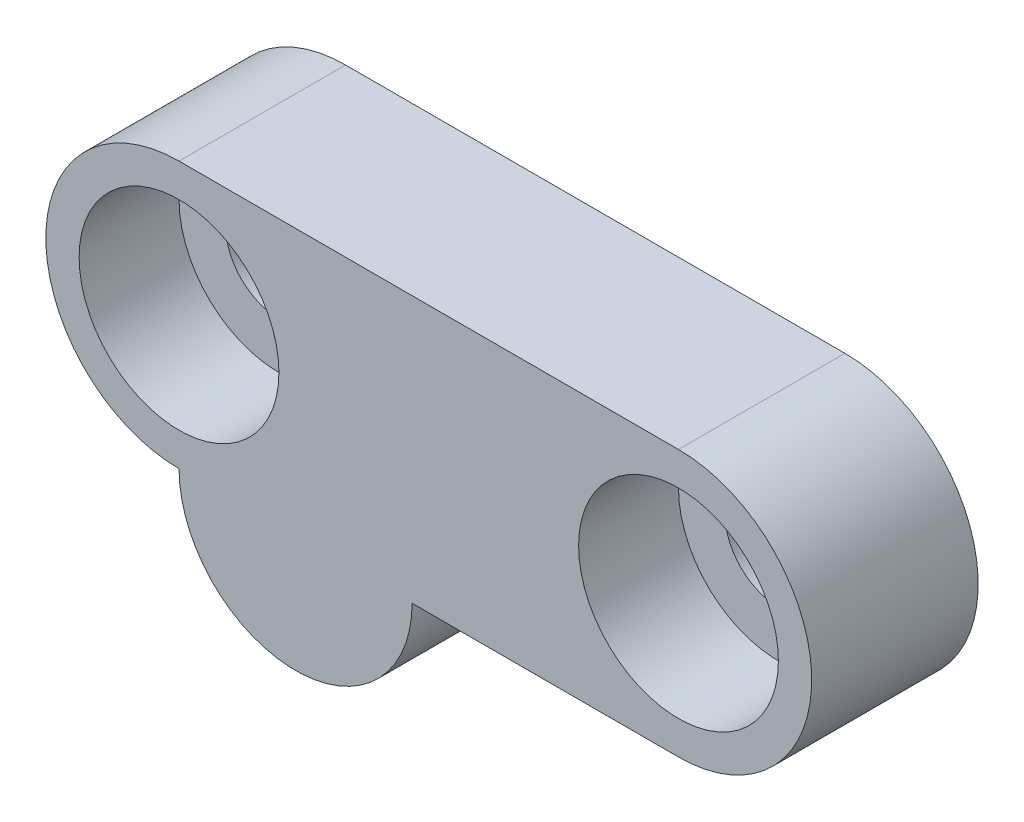
ISO-10303-21;
HEADER;
FILE_DESCRIPTION(('STEP AP214'),'2;1');
FILE_NAME('part.step','',(''),(''),'','','');
FILE_SCHEMA(('AUTOMOTIVE_DESIGN { 1 0 10303 214 1 1 1 1 }'));
ENDSEC;
DATA;
#1=APPLICATION_CONTEXT('core data for automotive mechanical design processes');
#2=APPLICATION_PROTOCOL_DEFINITION('international standard','automotive_design',2000,#1);
#3=PRODUCT_CONTEXT('',#1,'mechanical');
#4=PRODUCT('Part','Part','',(#3));
#5=PRODUCT_RELATED_PRODUCT_CATEGORY('part','',(#4));
#6=PRODUCT_DEFINITION_FORMATION('','',#4);
#7=PRODUCT_DEFINITION_CONTEXT('part definition',#1,'design');
#8=PRODUCT_DEFINITION('design','',#6,#7);
#9=PRODUCT_DEFINITION_SHAPE('','',#8);
#10=(LENGTH_UNIT() NAMED_UNIT(*) SI_UNIT(.MILLI.,.METRE.));
#11=(NAMED_UNIT(*) PLANE_ANGLE_UNIT() SI_UNIT($,.RADIAN.));
#12=(NAMED_UNIT(*) SI_UNIT($,.STERADIAN.) SOLID_ANGLE_UNIT());
#13=UNCERTAINTY_MEASURE_WITH_UNIT(LENGTH_MEASURE(1.E-05),#10,'distance_accuracy_value','');
#14=(GEOMETRIC_REPRESENTATION_CONTEXT(3) GLOBAL_UNCERTAINTY_ASSIGNED_CONTEXT((#13)) GLOBAL_UNIT_ASSIGNED_CONTEXT((#10,
#11,#12)) REPRESENTATION_CONTEXT('',''));
#15=CARTESIAN_POINT('',(0.,0.,0.));
#16=DIRECTION('',(0.,0.,1.));
#17=DIRECTION('',(1.,0.,0.));
#18=AXIS2_PLACEMENT_3D('',#15,#16,#17);
#19=CARTESIAN_POINT('',(0.,0.,27.));
#20=DIRECTION('',(0.,0.,-1.));
#21=DIRECTION('',(-1.,0.,0.));
#22=AXIS2_PLACEMENT_3D('',#19,#20,#21);
#23=CYLINDRICAL_SURFACE('',#22,1.6);
#24=CARTESIAN_POINT('',(0.,0.,22.));
#25=DIRECTION('',(0.,0.,1.));
#26=DIRECTION('',(1.,0.,0.));
#27=AXIS2_PLACEMENT_3D('',#24,#25,#26);
#28=CIRCLE('',#27,1.6);
#29=CARTESIAN_POINT('',(1.6,0.,22.));
#30=VERTEX_POINT('',#29);
#31=EDGE_CURVE('E120',#30,#30,#28,.T.);
#32=ORIENTED_EDGE('',*,*,#31,.F.);
#33=EDGE_LOOP('',(#32));
#34=FACE_BOUND('',#33,.T.);
#35=CARTESIAN_POINT('',(0.,0.,24.));
#36=DIRECTION('',(0.,0.,1.));
#37=DIRECTION('',(1.,0.,0.));
#38=AXIS2_PLACEMENT_3D('',#35,#36,#37);
#39=CIRCLE('',#38,1.6);
#40=CARTESIAN_POINT('',(1.6,0.,24.));
#41=VERTEX_POINT('',#40);
#42=EDGE_CURVE('E43',#41,#41,#39,.T.);
#43=ORIENTED_EDGE('',*,*,#42,.T.);
#44=EDGE_LOOP('',(#43));
#45=FACE_BOUND('',#44,.T.);
#46=ADVANCED_FACE('F39',(#34,#45),#23,.F.);
#47=CARTESIAN_POINT('',(15.,0.,27.));
#48=DIRECTION('',(0.,0.,-1.));
#49=DIRECTION('',(-1.,0.,0.));
#50=AXIS2_PLACEMENT_3D('',#47,#48,#49);
#51=CYLINDRICAL_SURFACE('',#50,1.6);
#52=CARTESIAN_POINT('',(15.,0.,22.));
#53=DIRECTION('',(0.,0.,1.));
#54=DIRECTION('',(1.,0.,0.));
#55=AXIS2_PLACEMENT_3D('',#52,#53,#54);
#56=CIRCLE('',#55,1.6);
#57=CARTESIAN_POINT('',(16.6,0.,22.));
#58=VERTEX_POINT('',#57);
#59=EDGE_CURVE('E134',#58,#58,#56,.T.);
#60=ORIENTED_EDGE('',*,*,#59,.F.);
#61=EDGE_LOOP('',(#60));
#62=FACE_BOUND('',#61,.T.);
#63=CARTESIAN_POINT('',(15.,0.,24.));
#64=DIRECTION('',(0.,0.,1.));
#65=DIRECTION('',(1.,0.,0.));
#66=AXIS2_PLACEMENT_3D('',#63,#64,#65);
#67=CIRCLE('',#66,1.6);
#68=CARTESIAN_POINT('',(16.6,0.,24.));
#69=VERTEX_POINT('',#68);
#70=EDGE_CURVE('E128',#69,#69,#67,.T.);
#71=ORIENTED_EDGE('',*,*,#70,.T.);
#72=EDGE_LOOP('',(#71));
#73=FACE_BOUND('',#72,.T.);
#74=ADVANCED_FACE('F167',(#62,#73),#51,.F.);
#75=CARTESIAN_POINT('',(0.,0.,27.));
#76=DIRECTION('',(0.,0.,1.));
#77=DIRECTION('',(1.,0.,0.));
#78=AXIS2_PLACEMENT_3D('',#75,#76,#77);
#79=PLANE('',#78);
#80=CARTESIAN_POINT('',(0.,0.,27.));
#81=DIRECTION('',(0.,0.,1.));
#82=DIRECTION('',(1.,0.,0.));
#83=AXIS2_PLACEMENT_3D('',#80,#81,#82);
#84=CIRCLE('',#83,3.);
#85=CARTESIAN_POINT('',(3.,0.,27.));
#86=VERTEX_POINT('',#85);
#87=EDGE_CURVE('E136',#86,#86,#84,.T.);
#88=ORIENTED_EDGE('',*,*,#87,.F.);
#89=EDGE_LOOP('',(#88));
#90=FACE_BOUND('',#89,.T.);
#91=CARTESIAN_POINT('',(15.,0.,27.));
#92=DIRECTION('',(0.,0.,1.));
#93=DIRECTION('',(1.,0.,0.));
#94=AXIS2_PLACEMENT_3D('',#91,#92,#93);
#95=CIRCLE('',#94,3.);
#96=CARTESIAN_POINT('',(18.,0.,27.));
#97=VERTEX_POINT('',#96);
#98=EDGE_CURVE('E141',#97,#97,#95,.T.);
#99=ORIENTED_EDGE('',*,*,#98,.F.);
#100=EDGE_LOOP('',(#99));
#101=FACE_BOUND('',#100,.T.);
#102=CARTESIAN_POINT('',(0.,0.,27.));
#103=DIRECTION('',(0.,0.,1.));
#104=DIRECTION('',(1.,0.,0.));
#105=AXIS2_PLACEMENT_3D('',#102,#103,#104);
#106=CIRCLE('',#105,4.);
#107=CARTESIAN_POINT('',(0.,4.,27.));
#108=VERTEX_POINT('',#107);
#109=CARTESIAN_POINT('',(0.,-4.,27.));
#110=VERTEX_POINT('',#109);
#111=EDGE_CURVE('E125',#108,#110,#106,.T.);
#112=ORIENTED_EDGE('',*,*,#111,.T.);
#113=CARTESIAN_POINT('',(3.5,-4.,27.));
#114=DIRECTION('',(0.,0.,1.));
#115=DIRECTION('',(1.,0.,0.));
#116=AXIS2_PLACEMENT_3D('',#113,#114,#115);
#117=CIRCLE('',#116,3.5);
#118=CARTESIAN_POINT('',(7.,-4.,27.));
#119=VERTEX_POINT('',#118);
#120=EDGE_CURVE('E92',#110,#119,#117,.T.);
#121=ORIENTED_EDGE('',*,*,#120,.T.);
#122=DIRECTION('',(1.,0.,0.));
#123=VECTOR('',#122,1.);
#124=CARTESIAN_POINT('',(7.,-4.,27.));
#125=LINE('',#124,#123);
#126=CARTESIAN_POINT('',(15.,-4.,27.));
#127=VERTEX_POINT('',#126);
#128=EDGE_CURVE('E96',#119,#127,#125,.T.);
#129=ORIENTED_EDGE('',*,*,#128,.T.);
#130=CARTESIAN_POINT('',(15.,0.,27.));
#131=DIRECTION('',(0.,0.,1.));
#132=DIRECTION('',(1.,0.,0.));
#133=AXIS2_PLACEMENT_3D('',#130,#131,#132);
#134=CIRCLE('',#133,4.);
#135=CARTESIAN_POINT('',(15.,4.,27.));
#136=VERTEX_POINT('',#135);
#137=EDGE_CURVE('E100',#127,#136,#134,.T.);
#138=ORIENTED_EDGE('',*,*,#137,.T.);
#139=DIRECTION('',(-1.,0.,0.));
#140=VECTOR('',#139,1.);
#141=CARTESIAN_POINT('',(0.,4.,27.));
#142=LINE('',#141,#140);
#143=EDGE_CURVE('E58',#136,#108,#142,.T.);
#144=ORIENTED_EDGE('',*,*,#143,.T.);
#145=EDGE_LOOP('',(#112,#121,#129,#138,#144));
#146=FACE_BOUND('',#145,.T.);
#147=ADVANCED_FACE('F98',(#90,#101,#146),#79,.T.);
#148=CARTESIAN_POINT('',(0.,0.,22.));
#149=DIRECTION('',(0.,0.,1.));
#150=DIRECTION('',(1.,0.,0.));
#151=AXIS2_PLACEMENT_3D('',#148,#149,#150);
#152=PLANE('',#151);
#153=CARTESIAN_POINT('',(0.,0.,22.));
#154=DIRECTION('',(0.,0.,1.));
#155=DIRECTION('',(1.,0.,0.));
#156=AXIS2_PLACEMENT_3D('',#153,#154,#155);
#157=CIRCLE('',#156,4.);
#158=CARTESIAN_POINT('',(0.,4.,22.));
#159=VERTEX_POINT('',#158);
#160=CARTESIAN_POINT('',(0.,-4.,22.));
#161=VERTEX_POINT('',#160);
#162=EDGE_CURVE('E116',#159,#161,#157,.T.);
#163=ORIENTED_EDGE('',*,*,#162,.F.);
#164=DIRECTION('',(-1.,0.,0.));
#165=VECTOR('',#164,1.);
#166=CARTESIAN_POINT('',(0.,4.,22.));
#167=LINE('',#166,#165);
#168=CARTESIAN_POINT('',(15.,4.,22.));
#169=VERTEX_POINT('',#168);
#170=EDGE_CURVE('E84',#169,#159,#167,.T.);
#171=ORIENTED_EDGE('',*,*,#170,.F.);
#172=CARTESIAN_POINT('',(15.,0.,22.));
#173=DIRECTION('',(0.,0.,1.));
#174=DIRECTION('',(1.,0.,0.));
#175=AXIS2_PLACEMENT_3D('',#172,#173,#174);
#176=CIRCLE('',#175,4.);
#177=CARTESIAN_POINT('',(15.,-4.,22.));
#178=VERTEX_POINT('',#177);
#179=EDGE_CURVE('E78',#178,#169,#176,.T.);
#180=ORIENTED_EDGE('',*,*,#179,.F.);
#181=DIRECTION('',(1.,0.,0.));
#182=VECTOR('',#181,1.);
#183=CARTESIAN_POINT('',(7.,-4.,22.));
#184=LINE('',#183,#182);
#185=CARTESIAN_POINT('',(7.,-4.,22.));
#186=VERTEX_POINT('',#185);
#187=EDGE_CURVE('E107',#186,#178,#184,.T.);
#188=ORIENTED_EDGE('',*,*,#187,.F.);
#189=CARTESIAN_POINT('',(3.5,-4.,22.));
#190=DIRECTION('',(0.,0.,1.));
#191=DIRECTION('',(1.,0.,0.));
#192=AXIS2_PLACEMENT_3D('',#189,#190,#191);
#193=CIRCLE('',#192,3.5);
#194=EDGE_CURVE('E119',#161,#186,#193,.T.);
#195=ORIENTED_EDGE('',*,*,#194,.F.);
#196=EDGE_LOOP('',(#163,#171,#180,#188,#195));
#197=FACE_BOUND('',#196,.T.);
#198=ORIENTED_EDGE('',*,*,#31,.T.);
#199=EDGE_LOOP('',(#198));
#200=FACE_BOUND('',#199,.T.);
#201=ORIENTED_EDGE('',*,*,#59,.T.);
#202=EDGE_LOOP('',(#201));
#203=FACE_BOUND('',#202,.T.);
#204=ADVANCED_FACE('F159',(#197,#200,#203),#152,.F.);
#205=CARTESIAN_POINT('',(0.,0.,27.));
#206=DIRECTION('',(0.,0.,-1.));
#207=DIRECTION('',(-1.,0.,0.));
#208=AXIS2_PLACEMENT_3D('',#205,#206,#207);
#209=CYLINDRICAL_SURFACE('',#208,4.);
#210=ORIENTED_EDGE('',*,*,#162,.T.);
#211=DIRECTION('',(0.,0.,-1.));
#212=VECTOR('',#211,1.);
#213=CARTESIAN_POINT('',(0.,-4.,27.));
#214=LINE('',#213,#212);
#215=EDGE_CURVE('E11',#110,#161,#214,.T.);
#216=ORIENTED_EDGE('',*,*,#215,.F.);
#217=ORIENTED_EDGE('',*,*,#111,.F.);
#218=DIRECTION('',(0.,0.,-1.));
#219=VECTOR('',#218,1.);
#220=CARTESIAN_POINT('',(0.,4.,27.));
#221=LINE('',#220,#219);
#222=EDGE_CURVE('E112',#108,#159,#221,.T.);
#223=ORIENTED_EDGE('',*,*,#222,.T.);
#224=EDGE_LOOP('',(#210,#216,#217,#223));
#225=FACE_BOUND('',#224,.T.);
#226=ADVANCED_FACE('F41',(#225),#209,.T.);
#227=CARTESIAN_POINT('',(3.5,-4.,27.));
#228=DIRECTION('',(0.,0.,-1.));
#229=DIRECTION('',(-1.,0.,0.));
#230=AXIS2_PLACEMENT_3D('',#227,#228,#229);
#231=CYLINDRICAL_SURFACE('',#230,3.5);
#232=ORIENTED_EDGE('',*,*,#194,.T.);
#233=DIRECTION('',(0.,0.,-1.));
#234=VECTOR('',#233,1.);
#235=CARTESIAN_POINT('',(7.,-4.,27.));
#236=LINE('',#235,#234);
#237=EDGE_CURVE('E49',#119,#186,#236,.T.);
#238=ORIENTED_EDGE('',*,*,#237,.F.);
#239=ORIENTED_EDGE('',*,*,#120,.F.);
#240=ORIENTED_EDGE('',*,*,#215,.T.);
#241=EDGE_LOOP('',(#232,#238,#239,#240));
#242=FACE_BOUND('',#241,.T.);
#243=ADVANCED_FACE('F157',(#242),#231,.T.);
#244=CARTESIAN_POINT('',(7.,-4.,27.));
#245=DIRECTION('',(0.,1.,0.));
#246=DIRECTION('',(0.,0.,1.));
#247=AXIS2_PLACEMENT_3D('',#244,#245,#246);
#248=PLANE('',#247);
#249=ORIENTED_EDGE('',*,*,#187,.T.);
#250=DIRECTION('',(0.,0.,-1.));
#251=VECTOR('',#250,1.);
#252=CARTESIAN_POINT('',(15.,-4.,27.));
#253=LINE('',#252,#251);
#254=EDGE_CURVE('E104',#127,#178,#253,.T.);
#255=ORIENTED_EDGE('',*,*,#254,.F.);
#256=ORIENTED_EDGE('',*,*,#128,.F.);
#257=ORIENTED_EDGE('',*,*,#237,.T.);
#258=EDGE_LOOP('',(#249,#255,#256,#257));
#259=FACE_BOUND('',#258,.T.);
#260=ADVANCED_FACE('F105',(#259),#248,.F.);
#261=CARTESIAN_POINT('',(15.,0.,27.));
#262=DIRECTION('',(0.,0.,-1.));
#263=DIRECTION('',(-1.,0.,0.));
#264=AXIS2_PLACEMENT_3D('',#261,#262,#263);
#265=CYLINDRICAL_SURFACE('',#264,4.);
#266=ORIENTED_EDGE('',*,*,#179,.T.);
#267=DIRECTION('',(0.,0.,-1.));
#268=VECTOR('',#267,1.);
#269=CARTESIAN_POINT('',(15.,4.,27.));
#270=LINE('',#269,#268);
#271=EDGE_CURVE('E108',#136,#169,#270,.T.);
#272=ORIENTED_EDGE('',*,*,#271,.F.);
#273=ORIENTED_EDGE('',*,*,#137,.F.);
#274=ORIENTED_EDGE('',*,*,#254,.T.);
#275=EDGE_LOOP('',(#266,#272,#273,#274));
#276=FACE_BOUND('',#275,.T.);
#277=ADVANCED_FACE('F110',(#276),#265,.T.);
#278=CARTESIAN_POINT('',(0.,4.,27.));
#279=DIRECTION('',(0.,-1.,0.));
#280=DIRECTION('',(0.,0.,-1.));
#281=AXIS2_PLACEMENT_3D('',#278,#279,#280);
#282=PLANE('',#281);
#283=ORIENTED_EDGE('',*,*,#170,.T.);
#284=ORIENTED_EDGE('',*,*,#222,.F.);
#285=ORIENTED_EDGE('',*,*,#143,.F.);
#286=ORIENTED_EDGE('',*,*,#271,.T.);
#287=EDGE_LOOP('',(#283,#284,#285,#286));
#288=FACE_BOUND('',#287,.T.);
#289=ADVANCED_FACE('F182',(#288),#282,.F.);
#290=CARTESIAN_POINT('',(15.,0.,24.));
#291=DIRECTION('',(0.,0.,1.));
#292=DIRECTION('',(1.,0.,0.));
#293=AXIS2_PLACEMENT_3D('',#290,#291,#292);
#294=CYLINDRICAL_SURFACE('',#293,3.);
#295=CARTESIAN_POINT('',(15.,0.,24.));
#296=DIRECTION('',(0.,0.,1.));
#297=DIRECTION('',(1.,0.,0.));
#298=AXIS2_PLACEMENT_3D('',#295,#296,#297);
#299=CIRCLE('',#298,3.);
#300=CARTESIAN_POINT('',(18.,0.,24.));
#301=VERTEX_POINT('',#300);
#302=EDGE_CURVE('E146',#301,#301,#299,.T.);
#303=ORIENTED_EDGE('',*,*,#302,.F.);
#304=EDGE_LOOP('',(#303));
#305=FACE_BOUND('',#304,.T.);
#306=ORIENTED_EDGE('',*,*,#98,.T.);
#307=EDGE_LOOP('',(#306));
#308=FACE_BOUND('',#307,.T.);
#309=ADVANCED_FACE('F185',(#305,#308),#294,.F.);
#310=CARTESIAN_POINT('',(15.,0.,24.));
#311=DIRECTION('',(0.,0.,1.));
#312=DIRECTION('',(1.,0.,0.));
#313=AXIS2_PLACEMENT_3D('',#310,#311,#312);
#314=PLANE('',#313);
#315=ORIENTED_EDGE('',*,*,#70,.F.);
#316=EDGE_LOOP('',(#315));
#317=FACE_BOUND('',#316,.T.);
#318=ORIENTED_EDGE('',*,*,#302,.T.);
#319=EDGE_LOOP('',(#318));
#320=FACE_BOUND('',#319,.T.);
#321=ADVANCED_FACE('F179',(#317,#320),#314,.T.);
#322=CARTESIAN_POINT('',(0.,0.,24.));
#323=DIRECTION('',(0.,0.,1.));
#324=DIRECTION('',(1.,0.,0.));
#325=AXIS2_PLACEMENT_3D('',#322,#323,#324);
#326=CYLINDRICAL_SURFACE('',#325,3.);
#327=CARTESIAN_POINT('',(0.,0.,24.));
#328=DIRECTION('',(0.,0.,1.));
#329=DIRECTION('',(1.,0.,0.));
#330=AXIS2_PLACEMENT_3D('',#327,#328,#329);
#331=CIRCLE('',#330,3.);
#332=CARTESIAN_POINT('',(3.,0.,24.));
#333=VERTEX_POINT('',#332);
#334=EDGE_CURVE('E130',#333,#333,#331,.T.);
#335=ORIENTED_EDGE('',*,*,#334,.F.);
#336=EDGE_LOOP('',(#335));
#337=FACE_BOUND('',#336,.T.);
#338=ORIENTED_EDGE('',*,*,#87,.T.);
#339=EDGE_LOOP('',(#338));
#340=FACE_BOUND('',#339,.T.);
#341=ADVANCED_FACE('F222',(#337,#340),#326,.F.);
#342=CARTESIAN_POINT('',(0.,0.,24.));
#343=DIRECTION('',(0.,0.,1.));
#344=DIRECTION('',(1.,0.,0.));
#345=AXIS2_PLACEMENT_3D('',#342,#343,#344);
#346=PLANE('',#345);
#347=ORIENTED_EDGE('',*,*,#42,.F.);
#348=EDGE_LOOP('',(#347));
#349=FACE_BOUND('',#348,.T.);
#350=ORIENTED_EDGE('',*,*,#334,.T.);
#351=EDGE_LOOP('',(#350));
#352=FACE_BOUND('',#351,.T.);
#353=ADVANCED_FACE('F230',(#349,#352),#346,.T.);
#354=CLOSED_SHELL('',(#46,#74,#147,#204,#226,#243,#260,#277,#289,#309,#321,#341,#353));
#355=MANIFOLD_SOLID_BREP('B2',#354);
#356=ADVANCED_BREP_SHAPE_REPRESENTATION('',(#18,#355),#14);
#357=SHAPE_DEFINITION_REPRESENTATION(#9,#356);
ENDSEC;
END-ISO-10303-21;
